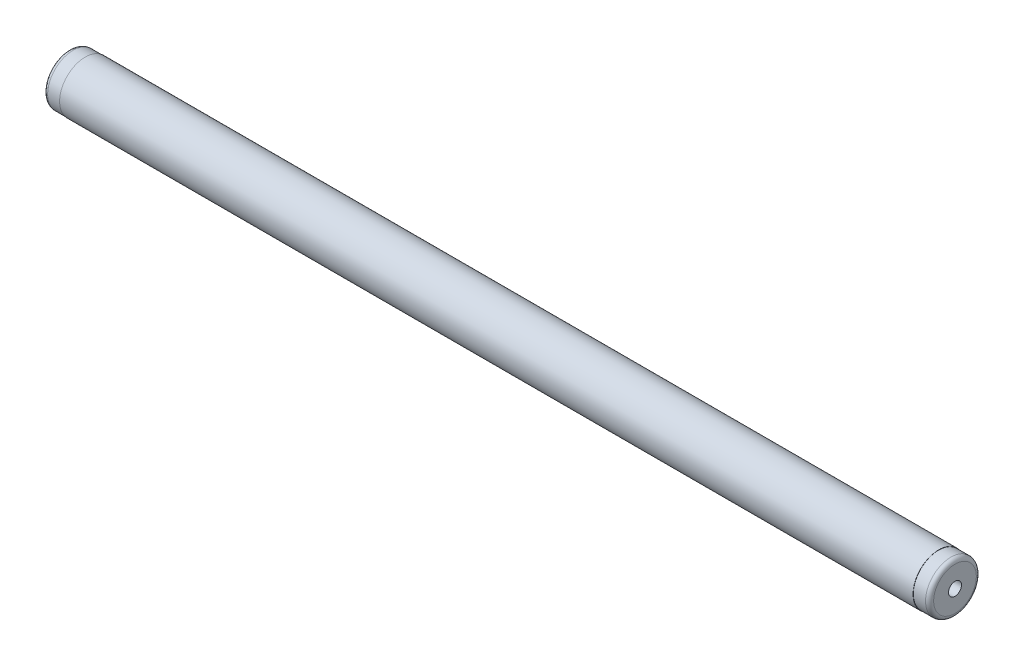
ISO-10303-21;
HEADER;
FILE_DESCRIPTION(('STEP AP214'),'2;1');
FILE_NAME('part.step','',(''),(''),'','','');
FILE_SCHEMA(('AUTOMOTIVE_DESIGN { 1 0 10303 214 1 1 1 1 }'));
ENDSEC;
DATA;
#1=APPLICATION_CONTEXT('core data for automotive mechanical design processes');
#2=APPLICATION_PROTOCOL_DEFINITION('international standard','automotive_design',2000,#1);
#3=PRODUCT_CONTEXT('',#1,'mechanical');
#4=PRODUCT('Part','Part','',(#3));
#5=PRODUCT_RELATED_PRODUCT_CATEGORY('part','',(#4));
#6=PRODUCT_DEFINITION_FORMATION('','',#4);
#7=PRODUCT_DEFINITION_CONTEXT('part definition',#1,'design');
#8=PRODUCT_DEFINITION('design','',#6,#7);
#9=PRODUCT_DEFINITION_SHAPE('','',#8);
#10=(LENGTH_UNIT() NAMED_UNIT(*) SI_UNIT(.MILLI.,.METRE.));
#11=(NAMED_UNIT(*) PLANE_ANGLE_UNIT() SI_UNIT($,.RADIAN.));
#12=(NAMED_UNIT(*) SI_UNIT($,.STERADIAN.) SOLID_ANGLE_UNIT());
#13=UNCERTAINTY_MEASURE_WITH_UNIT(LENGTH_MEASURE(1.E-05),#10,'distance_accuracy_value','');
#14=(GEOMETRIC_REPRESENTATION_CONTEXT(3) GLOBAL_UNCERTAINTY_ASSIGNED_CONTEXT((#13)) GLOBAL_UNIT_ASSIGNED_CONTEXT((#10,
#11,#12)) REPRESENTATION_CONTEXT('',''));
#15=CARTESIAN_POINT('',(0.,0.,0.));
#16=DIRECTION('',(0.,0.,1.));
#17=DIRECTION('',(1.,0.,0.));
#18=AXIS2_PLACEMENT_3D('',#15,#16,#17);
#19=CARTESIAN_POINT('',(51.5,0.4,0.));
#20=DIRECTION('',(1.,0.,0.));
#21=DIRECTION('',(0.,0.,-1.));
#22=AXIS2_PLACEMENT_3D('',#19,#20,#21);
#23=PLANE('',#22);
#24=CARTESIAN_POINT('',(51.5,0.,0.));
#25=DIRECTION('',(1.,0.,0.));
#26=DIRECTION('',(0.,0.,-1.));
#27=AXIS2_PLACEMENT_3D('',#24,#25,#26);
#28=CIRCLE('',#27,0.8);
#29=CARTESIAN_POINT('',(51.5,0.,-0.8));
#30=VERTEX_POINT('',#29);
#31=EDGE_CURVE('E18',#30,#30,#28,.T.);
#32=ORIENTED_EDGE('',*,*,#31,.T.);
#33=EDGE_LOOP('',(#32));
#34=FACE_BOUND('',#33,.T.);
#35=ADVANCED_FACE('F15',(#34),#23,.T.);
#36=CARTESIAN_POINT('',(-51.5,0.4,0.));
#37=DIRECTION('',(-1.,0.,0.));
#38=DIRECTION('',(0.,0.,1.));
#39=AXIS2_PLACEMENT_3D('',#36,#37,#38);
#40=PLANE('',#39);
#41=CARTESIAN_POINT('',(-51.5,0.,0.));
#42=DIRECTION('',(1.,0.,0.));
#43=DIRECTION('',(0.,0.,-1.));
#44=AXIS2_PLACEMENT_3D('',#41,#42,#43);
#45=CIRCLE('',#44,0.8);
#46=CARTESIAN_POINT('',(-51.5,0.,-0.8));
#47=VERTEX_POINT('',#46);
#48=EDGE_CURVE('E47',#47,#47,#45,.F.);
#49=ORIENTED_EDGE('',*,*,#48,.T.);
#50=EDGE_LOOP('',(#49));
#51=FACE_BOUND('',#50,.T.);
#52=ADVANCED_FACE('F58',(#51),#40,.T.);
#53=CARTESIAN_POINT('',(53.,0.,0.));
#54=DIRECTION('',(1.,0.,0.));
#55=DIRECTION('',(0.,0.,-1.));
#56=AXIS2_PLACEMENT_3D('',#53,#54,#55);
#57=CYLINDRICAL_SURFACE('',#56,0.8);
#58=CARTESIAN_POINT('',(54.5,0.,0.));
#59=DIRECTION('',(1.,0.,0.));
#60=DIRECTION('',(0.,0.,-1.));
#61=AXIS2_PLACEMENT_3D('',#58,#59,#60);
#62=CIRCLE('',#61,0.8);
#63=CARTESIAN_POINT('',(54.5,0.,-0.8));
#64=VERTEX_POINT('',#63);
#65=EDGE_CURVE('E45',#64,#64,#62,.F.);
#66=ORIENTED_EDGE('',*,*,#65,.F.);
#67=EDGE_LOOP('',(#66));
#68=FACE_BOUND('',#67,.T.);
#69=ORIENTED_EDGE('',*,*,#31,.F.);
#70=EDGE_LOOP('',(#69));
#71=FACE_BOUND('',#70,.T.);
#72=ADVANCED_FACE('F55',(#68,#71),#57,.F.);
#73=CARTESIAN_POINT('',(-53.,0.,0.));
#74=DIRECTION('',(1.,0.,0.));
#75=DIRECTION('',(0.,0.,-1.));
#76=AXIS2_PLACEMENT_3D('',#73,#74,#75);
#77=CYLINDRICAL_SURFACE('',#76,0.8);
#78=ORIENTED_EDGE('',*,*,#48,.F.);
#79=EDGE_LOOP('',(#78));
#80=FACE_BOUND('',#79,.T.);
#81=CARTESIAN_POINT('',(-54.5,0.,0.));
#82=DIRECTION('',(1.,0.,0.));
#83=DIRECTION('',(0.,0.,-1.));
#84=AXIS2_PLACEMENT_3D('',#81,#82,#83);
#85=CIRCLE('',#84,0.8);
#86=CARTESIAN_POINT('',(-54.5,0.,-0.8));
#87=VERTEX_POINT('',#86);
#88=EDGE_CURVE('E41',#87,#87,#85,.T.);
#89=ORIENTED_EDGE('',*,*,#88,.F.);
#90=EDGE_LOOP('',(#89));
#91=FACE_BOUND('',#90,.T.);
#92=ADVANCED_FACE('F57',(#80,#91),#77,.F.);
#93=CARTESIAN_POINT('',(54.5,1.7125,0.));
#94=DIRECTION('',(1.,0.,0.));
#95=DIRECTION('',(0.,0.,-1.));
#96=AXIS2_PLACEMENT_3D('',#93,#94,#95);
#97=PLANE('',#96);
#98=ORIENTED_EDGE('',*,*,#65,.T.);
#99=EDGE_LOOP('',(#98));
#100=FACE_BOUND('',#99,.T.);
#101=CARTESIAN_POINT('',(54.5,0.,0.));
#102=DIRECTION('',(-1.,0.,0.));
#103=DIRECTION('',(0.,1.,0.));
#104=AXIS2_PLACEMENT_3D('',#101,#102,#103);
#105=CIRCLE('',#104,2.625);
#106=CARTESIAN_POINT('',(54.5,2.625,0.));
#107=VERTEX_POINT('',#106);
#108=EDGE_CURVE('E44',#107,#107,#105,.T.);
#109=ORIENTED_EDGE('',*,*,#108,.F.);
#110=EDGE_LOOP('',(#109));
#111=FACE_BOUND('',#110,.T.);
#112=ADVANCED_FACE('F66',(#100,#111),#97,.T.);
#113=CARTESIAN_POINT('',(-54.5,1.7125,0.));
#114=DIRECTION('',(-1.,0.,0.));
#115=DIRECTION('',(0.,0.,1.));
#116=AXIS2_PLACEMENT_3D('',#113,#114,#115);
#117=PLANE('',#116);
#118=ORIENTED_EDGE('',*,*,#88,.T.);
#119=EDGE_LOOP('',(#118));
#120=FACE_BOUND('',#119,.T.);
#121=CARTESIAN_POINT('',(-54.5,0.,0.));
#122=DIRECTION('',(1.,0.,0.));
#123=DIRECTION('',(0.,1.,0.));
#124=AXIS2_PLACEMENT_3D('',#121,#122,#123);
#125=CIRCLE('',#124,2.625);
#126=CARTESIAN_POINT('',(-54.5,2.625,0.));
#127=VERTEX_POINT('',#126);
#128=EDGE_CURVE('E113',#127,#127,#125,.T.);
#129=ORIENTED_EDGE('',*,*,#128,.F.);
#130=EDGE_LOOP('',(#129));
#131=FACE_BOUND('',#130,.T.);
#132=ADVANCED_FACE('F117',(#120,#131),#117,.T.);
#133=CARTESIAN_POINT('',(54.,0.,0.));
#134=DIRECTION('',(1.,0.,0.));
#135=DIRECTION('',(0.,0.,-1.));
#136=AXIS2_PLACEMENT_3D('',#133,#134,#135);
#137=TOROIDAL_SURFACE('',#136,2.625,0.5);
#138=CARTESIAN_POINT('',(54.,0.,0.));
#139=DIRECTION('',(1.,0.,0.));
#140=DIRECTION('',(0.,0.,-1.));
#141=AXIS2_PLACEMENT_3D('',#138,#139,#140);
#142=CIRCLE('',#141,3.125);
#143=CARTESIAN_POINT('',(54.,0.,-3.125));
#144=VERTEX_POINT('',#143);
#145=EDGE_CURVE('E143',#144,#144,#142,.F.);
#146=ORIENTED_EDGE('',*,*,#145,.F.);
#147=EDGE_LOOP('',(#146));
#148=FACE_BOUND('',#147,.T.);
#149=ORIENTED_EDGE('',*,*,#108,.T.);
#150=EDGE_LOOP('',(#149));
#151=FACE_BOUND('',#150,.T.);
#152=ADVANCED_FACE('F97',(#148,#151),#137,.T.);
#153=CARTESIAN_POINT('',(-54.,0.,0.));
#154=DIRECTION('',(1.,0.,0.));
#155=DIRECTION('',(0.,0.,-1.));
#156=AXIS2_PLACEMENT_3D('',#153,#154,#155);
#157=TOROIDAL_SURFACE('',#156,2.625,0.5);
#158=ORIENTED_EDGE('',*,*,#128,.T.);
#159=EDGE_LOOP('',(#158));
#160=FACE_BOUND('',#159,.T.);
#161=CARTESIAN_POINT('',(-54.,0.,0.));
#162=DIRECTION('',(1.,0.,0.));
#163=DIRECTION('',(0.,0.,-1.));
#164=AXIS2_PLACEMENT_3D('',#161,#162,#163);
#165=CIRCLE('',#164,3.125);
#166=CARTESIAN_POINT('',(-54.,0.,-3.125));
#167=VERTEX_POINT('',#166);
#168=EDGE_CURVE('E40',#167,#167,#165,.T.);
#169=ORIENTED_EDGE('',*,*,#168,.F.);
#170=EDGE_LOOP('',(#169));
#171=FACE_BOUND('',#170,.T.);
#172=ADVANCED_FACE('F92',(#160,#171),#157,.T.);
#173=CARTESIAN_POINT('',(53.25,0.,0.));
#174=DIRECTION('',(1.,0.,0.));
#175=DIRECTION('',(0.,0.,-1.));
#176=AXIS2_PLACEMENT_3D('',#173,#174,#175);
#177=CYLINDRICAL_SURFACE('',#176,3.125);
#178=CARTESIAN_POINT('',(52.5,0.,0.));
#179=DIRECTION('',(1.,0.,0.));
#180=DIRECTION('',(0.,0.,-1.));
#181=AXIS2_PLACEMENT_3D('',#178,#179,#180);
#182=CIRCLE('',#181,3.125);
#183=CARTESIAN_POINT('',(52.5,0.,-3.125));
#184=VERTEX_POINT('',#183);
#185=EDGE_CURVE('E37',#184,#184,#182,.F.);
#186=ORIENTED_EDGE('',*,*,#185,.F.);
#187=EDGE_LOOP('',(#186));
#188=FACE_BOUND('',#187,.T.);
#189=ORIENTED_EDGE('',*,*,#145,.T.);
#190=EDGE_LOOP('',(#189));
#191=FACE_BOUND('',#190,.T.);
#192=ADVANCED_FACE('F88',(#188,#191),#177,.T.);
#193=CARTESIAN_POINT('',(-53.25,0.,0.));
#194=DIRECTION('',(1.,0.,0.));
#195=DIRECTION('',(0.,0.,-1.));
#196=AXIS2_PLACEMENT_3D('',#193,#194,#195);
#197=CYLINDRICAL_SURFACE('',#196,3.125);
#198=ORIENTED_EDGE('',*,*,#168,.T.);
#199=EDGE_LOOP('',(#198));
#200=FACE_BOUND('',#199,.T.);
#201=CARTESIAN_POINT('',(-52.5,0.,0.));
#202=DIRECTION('',(1.,0.,0.));
#203=DIRECTION('',(0.,0.,-1.));
#204=AXIS2_PLACEMENT_3D('',#201,#202,#203);
#205=CIRCLE('',#204,3.125);
#206=CARTESIAN_POINT('',(-52.5,0.,-3.125));
#207=VERTEX_POINT('',#206);
#208=EDGE_CURVE('E27',#207,#207,#205,.T.);
#209=ORIENTED_EDGE('',*,*,#208,.F.);
#210=EDGE_LOOP('',(#209));
#211=FACE_BOUND('',#210,.T.);
#212=ADVANCED_FACE('F84',(#200,#211),#197,.T.);
#213=CARTESIAN_POINT('',(52.5,3.14,0.));
#214=DIRECTION('',(1.,0.,0.));
#215=DIRECTION('',(0.,0.,-1.));
#216=AXIS2_PLACEMENT_3D('',#213,#214,#215);
#217=PLANE('',#216);
#218=ORIENTED_EDGE('',*,*,#185,.T.);
#219=EDGE_LOOP('',(#218));
#220=FACE_BOUND('',#219,.T.);
#221=CARTESIAN_POINT('',(52.5,0.,0.));
#222=DIRECTION('',(1.,0.,0.));
#223=DIRECTION('',(0.,0.,-1.));
#224=AXIS2_PLACEMENT_3D('',#221,#222,#223);
#225=CIRCLE('',#224,3.155);
#226=CARTESIAN_POINT('',(52.5,0.,-3.155));
#227=VERTEX_POINT('',#226);
#228=EDGE_CURVE('E22',#227,#227,#225,.F.);
#229=ORIENTED_EDGE('',*,*,#228,.F.);
#230=EDGE_LOOP('',(#229));
#231=FACE_BOUND('',#230,.T.);
#232=ADVANCED_FACE('F77',(#220,#231),#217,.T.);
#233=CARTESIAN_POINT('',(-52.5,3.14,0.));
#234=DIRECTION('',(-1.,0.,0.));
#235=DIRECTION('',(0.,0.,1.));
#236=AXIS2_PLACEMENT_3D('',#233,#234,#235);
#237=PLANE('',#236);
#238=ORIENTED_EDGE('',*,*,#208,.T.);
#239=EDGE_LOOP('',(#238));
#240=FACE_BOUND('',#239,.T.);
#241=CARTESIAN_POINT('',(-52.5,0.,0.));
#242=DIRECTION('',(1.,0.,0.));
#243=DIRECTION('',(0.,0.,-1.));
#244=AXIS2_PLACEMENT_3D('',#241,#242,#243);
#245=CIRCLE('',#244,3.155);
#246=CARTESIAN_POINT('',(-52.5,0.,-3.155));
#247=VERTEX_POINT('',#246);
#248=EDGE_CURVE('E10',#247,#247,#245,.T.);
#249=ORIENTED_EDGE('',*,*,#248,.F.);
#250=EDGE_LOOP('',(#249));
#251=FACE_BOUND('',#250,.T.);
#252=ADVANCED_FACE('F72',(#240,#251),#237,.T.);
#253=CARTESIAN_POINT('',(0.,0.,0.));
#254=DIRECTION('',(1.,0.,0.));
#255=DIRECTION('',(0.,0.,-1.));
#256=AXIS2_PLACEMENT_3D('',#253,#254,#255);
#257=CYLINDRICAL_SURFACE('',#256,3.155);
#258=ORIENTED_EDGE('',*,*,#248,.T.);
#259=EDGE_LOOP('',(#258));
#260=FACE_BOUND('',#259,.T.);
#261=ORIENTED_EDGE('',*,*,#228,.T.);
#262=EDGE_LOOP('',(#261));
#263=FACE_BOUND('',#262,.T.);
#264=ADVANCED_FACE('F70',(#260,#263),#257,.T.);
#265=CLOSED_SHELL('',(#35,#52,#72,#92,#112,#132,#152,#172,#192,#212,#232,#252,#264));
#266=MANIFOLD_SOLID_BREP('B1',#265);
#267=ADVANCED_BREP_SHAPE_REPRESENTATION('',(#18,#266),#14);
#268=SHAPE_DEFINITION_REPRESENTATION(#9,#267);
ENDSEC;
END-ISO-10303-21;
